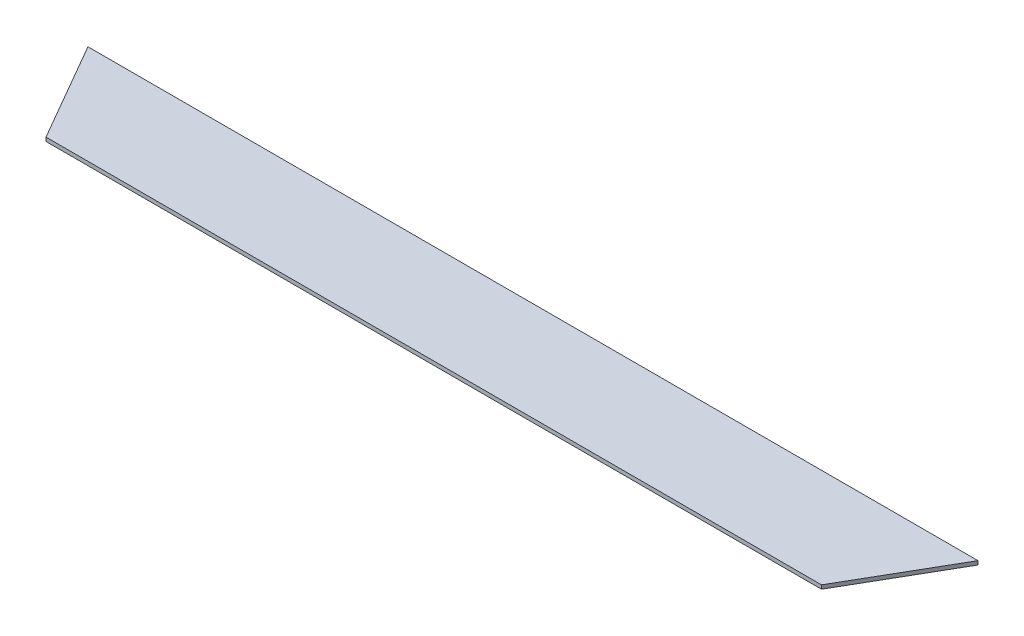
ISO-10303-21;
HEADER;
FILE_DESCRIPTION(('STEP AP214'),'2;1');
FILE_NAME('part.step','',(''),(''),'','','');
FILE_SCHEMA(('AUTOMOTIVE_DESIGN { 1 0 10303 214 1 1 1 1 }'));
ENDSEC;
DATA;
#1=APPLICATION_CONTEXT('core data for automotive mechanical design processes');
#2=APPLICATION_PROTOCOL_DEFINITION('international standard','automotive_design',2000,#1);
#3=PRODUCT_CONTEXT('',#1,'mechanical');
#4=PRODUCT('Part','Part','',(#3));
#5=PRODUCT_RELATED_PRODUCT_CATEGORY('part','',(#4));
#6=PRODUCT_DEFINITION_FORMATION('','',#4);
#7=PRODUCT_DEFINITION_CONTEXT('part definition',#1,'design');
#8=PRODUCT_DEFINITION('design','',#6,#7);
#9=PRODUCT_DEFINITION_SHAPE('','',#8);
#10=(LENGTH_UNIT() NAMED_UNIT(*) SI_UNIT(.MILLI.,.METRE.));
#11=(NAMED_UNIT(*) PLANE_ANGLE_UNIT() SI_UNIT($,.RADIAN.));
#12=(NAMED_UNIT(*) SI_UNIT($,.STERADIAN.) SOLID_ANGLE_UNIT());
#13=UNCERTAINTY_MEASURE_WITH_UNIT(LENGTH_MEASURE(1.E-05),#10,'distance_accuracy_value','');
#14=(GEOMETRIC_REPRESENTATION_CONTEXT(3) GLOBAL_UNCERTAINTY_ASSIGNED_CONTEXT((#13)) GLOBAL_UNIT_ASSIGNED_CONTEXT((#10,
#11,#12)) REPRESENTATION_CONTEXT('',''));
#15=CARTESIAN_POINT('',(0.,0.,0.));
#16=DIRECTION('',(0.,0.,1.));
#17=DIRECTION('',(1.,0.,0.));
#18=AXIS2_PLACEMENT_3D('',#15,#16,#17);
#19=CARTESIAN_POINT('',(0.,6.35,0.));
#20=DIRECTION('',(0.,1.,0.));
#21=DIRECTION('',(0.,0.,1.));
#22=AXIS2_PLACEMENT_3D('',#19,#20,#21);
#23=PLANE('',#22);
#24=DIRECTION('',(-1.,0.,0.));
#25=VECTOR('',#24,1.);
#26=CARTESIAN_POINT('',(740.58367420942,6.35,-79.375));
#27=LINE('',#26,#25);
#28=CARTESIAN_POINT('',(-740.58367420942,6.35,-79.375));
#29=VERTEX_POINT('',#28);
#30=CARTESIAN_POINT('',(740.583674209374,6.35,-79.3750000000266));
#31=VERTEX_POINT('',#30);
#32=EDGE_CURVE('E81',#29,#31,#27,.F.);
#33=ORIENTED_EDGE('',*,*,#32,.F.);
#34=DIRECTION('',(0.500000000000017,0.,0.866025403784429));
#35=VECTOR('',#34,1.);
#36=CARTESIAN_POINT('',(-740.58367420942,6.35,-79.375));
#37=LINE('',#36,#35);
#38=CARTESIAN_POINT('',(-645.263144766066,6.35,85.725000000033));
#39=VERTEX_POINT('',#38);
#40=EDGE_CURVE('E77',#39,#29,#37,.F.);
#41=ORIENTED_EDGE('',*,*,#40,.F.);
#42=DIRECTION('',(1.,0.,0.));
#43=VECTOR('',#42,1.);
#44=CARTESIAN_POINT('',(-645.263144766024,6.35,85.725));
#45=LINE('',#44,#43);
#46=CARTESIAN_POINT('',(645.263144766024,6.35,85.725));
#47=VERTEX_POINT('',#46);
#48=EDGE_CURVE('E79',#47,#39,#45,.F.);
#49=ORIENTED_EDGE('',*,*,#48,.F.);
#50=DIRECTION('',(0.500000000000017,0.,-0.866025403784429));
#51=VECTOR('',#50,1.);
#52=CARTESIAN_POINT('',(645.263144766024,6.35,85.725));
#53=LINE('',#52,#51);
#54=EDGE_CURVE('E72',#31,#47,#53,.F.);
#55=ORIENTED_EDGE('',*,*,#54,.F.);
#56=EDGE_LOOP('',(#33,#41,#49,#55));
#57=FACE_BOUND('',#56,.T.);
#58=ADVANCED_FACE('F33',(#57),#23,.T.);
#59=CARTESIAN_POINT('',(-645.263144766024,0.,85.725));
#60=DIRECTION('',(0.,0.,1.));
#61=DIRECTION('',(1.,0.,0.));
#62=AXIS2_PLACEMENT_3D('',#59,#60,#61);
#63=PLANE('',#62);
#64=ORIENTED_EDGE('',*,*,#48,.T.);
#65=DIRECTION('',(0.,1.,0.));
#66=VECTOR('',#65,1.);
#67=CARTESIAN_POINT('',(-645.263144766024,0.,85.725));
#68=LINE('',#67,#66);
#69=CARTESIAN_POINT('',(-645.263144766024,0.,85.7250000000169));
#70=VERTEX_POINT('',#69);
#71=EDGE_CURVE('E91',#39,#70,#68,.F.);
#72=ORIENTED_EDGE('',*,*,#71,.T.);
#73=DIRECTION('',(1.,0.,0.));
#74=VECTOR('',#73,1.);
#75=CARTESIAN_POINT('',(0.,0.,85.7250000000254));
#76=LINE('',#75,#74);
#77=CARTESIAN_POINT('',(645.263144766014,0.,85.7250000000169));
#78=VERTEX_POINT('',#77);
#79=EDGE_CURVE('E118',#70,#78,#76,.T.);
#80=ORIENTED_EDGE('',*,*,#79,.T.);
#81=DIRECTION('',(0.,1.,0.));
#82=VECTOR('',#81,1.);
#83=CARTESIAN_POINT('',(645.263144766024,0.,85.725));
#84=LINE('',#83,#82);
#85=EDGE_CURVE('E92',#47,#78,#84,.F.);
#86=ORIENTED_EDGE('',*,*,#85,.F.);
#87=EDGE_LOOP('',(#64,#72,#80,#86));
#88=FACE_BOUND('',#87,.T.);
#89=ADVANCED_FACE('F89',(#88),#63,.T.);
#90=CARTESIAN_POINT('',(645.263144766024,0.,85.725));
#91=DIRECTION('',(0.866025403784429,0.,0.500000000000017));
#92=DIRECTION('',(0.500000000000017,0.,-0.866025403784429));
#93=AXIS2_PLACEMENT_3D('',#90,#91,#92);
#94=PLANE('',#93);
#95=ORIENTED_EDGE('',*,*,#54,.T.);
#96=ORIENTED_EDGE('',*,*,#85,.T.);
#97=DIRECTION('',(0.500000000000685,0.,-0.866025403784043));
#98=VECTOR('',#97,1.);
#99=CARTESIAN_POINT('',(645.263144766024,0.,85.725));
#100=LINE('',#99,#98);
#101=CARTESIAN_POINT('',(740.58367420942,0.,-79.3750000000169));
#102=VERTEX_POINT('',#101);
#103=EDGE_CURVE('E42',#78,#102,#100,.T.);
#104=ORIENTED_EDGE('',*,*,#103,.T.);
#105=DIRECTION('',(0.,1.,0.));
#106=VECTOR('',#105,1.);
#107=CARTESIAN_POINT('',(740.58367420942,0.,-79.375));
#108=LINE('',#107,#106);
#109=EDGE_CURVE('E86',#31,#102,#108,.F.);
#110=ORIENTED_EDGE('',*,*,#109,.F.);
#111=EDGE_LOOP('',(#95,#96,#104,#110));
#112=FACE_BOUND('',#111,.T.);
#113=ADVANCED_FACE('F131',(#112),#94,.T.);
#114=CARTESIAN_POINT('',(740.58367420942,0.,-79.375));
#115=DIRECTION('',(0.,0.,-1.));
#116=DIRECTION('',(-1.,0.,0.));
#117=AXIS2_PLACEMENT_3D('',#114,#115,#116);
#118=PLANE('',#117);
#119=ORIENTED_EDGE('',*,*,#32,.T.);
#120=ORIENTED_EDGE('',*,*,#109,.T.);
#121=DIRECTION('',(1.,0.,0.));
#122=VECTOR('',#121,1.);
#123=CARTESIAN_POINT('',(0.,0.,-79.3750000000254));
#124=LINE('',#123,#122);
#125=CARTESIAN_POINT('',(-740.58367420943,0.,-79.3750000000169));
#126=VERTEX_POINT('',#125);
#127=EDGE_CURVE('E11',#102,#126,#124,.F.);
#128=ORIENTED_EDGE('',*,*,#127,.T.);
#129=DIRECTION('',(0.,1.,0.));
#130=VECTOR('',#129,1.);
#131=CARTESIAN_POINT('',(-740.58367420942,0.,-79.375));
#132=LINE('',#131,#130);
#133=EDGE_CURVE('E85',#29,#126,#132,.F.);
#134=ORIENTED_EDGE('',*,*,#133,.F.);
#135=EDGE_LOOP('',(#119,#120,#128,#134));
#136=FACE_BOUND('',#135,.T.);
#137=ADVANCED_FACE('F129',(#136),#118,.T.);
#138=CARTESIAN_POINT('',(-740.58367420942,0.,-79.375));
#139=DIRECTION('',(-0.866025403784429,0.,0.500000000000017));
#140=DIRECTION('',(0.500000000000017,0.,0.866025403784429));
#141=AXIS2_PLACEMENT_3D('',#138,#139,#140);
#142=PLANE('',#141);
#143=ORIENTED_EDGE('',*,*,#133,.T.);
#144=DIRECTION('',(0.499999999999912,0.,0.866025403784489));
#145=VECTOR('',#144,1.);
#146=CARTESIAN_POINT('',(-681.345351930396,0.,23.2287839420928));
#147=LINE('',#146,#145);
#148=EDGE_CURVE('E51',#126,#70,#147,.T.);
#149=ORIENTED_EDGE('',*,*,#148,.T.);
#150=ORIENTED_EDGE('',*,*,#71,.F.);
#151=ORIENTED_EDGE('',*,*,#40,.T.);
#152=EDGE_LOOP('',(#143,#149,#150,#151));
#153=FACE_BOUND('',#152,.T.);
#154=ADVANCED_FACE('F93',(#153),#142,.T.);
#155=CARTESIAN_POINT('',(0.,0.,0.));
#156=DIRECTION('',(0.,1.,0.));
#157=DIRECTION('',(0.,0.,1.));
#158=AXIS2_PLACEMENT_3D('',#155,#156,#157);
#159=PLANE('',#158);
#160=ORIENTED_EDGE('',*,*,#148,.F.);
#161=ORIENTED_EDGE('',*,*,#127,.F.);
#162=ORIENTED_EDGE('',*,*,#103,.F.);
#163=ORIENTED_EDGE('',*,*,#79,.F.);
#164=EDGE_LOOP('',(#160,#161,#162,#163));
#165=FACE_BOUND('',#164,.T.);
#166=ADVANCED_FACE('F130',(#165),#159,.F.);
#167=CLOSED_SHELL('',(#58,#89,#113,#137,#154,#166));
#168=MANIFOLD_SOLID_BREP('B2',#167);
#169=ADVANCED_BREP_SHAPE_REPRESENTATION('',(#18,#168),#14);
#170=SHAPE_DEFINITION_REPRESENTATION(#9,#169);
ENDSEC;
END-ISO-10303-21;
